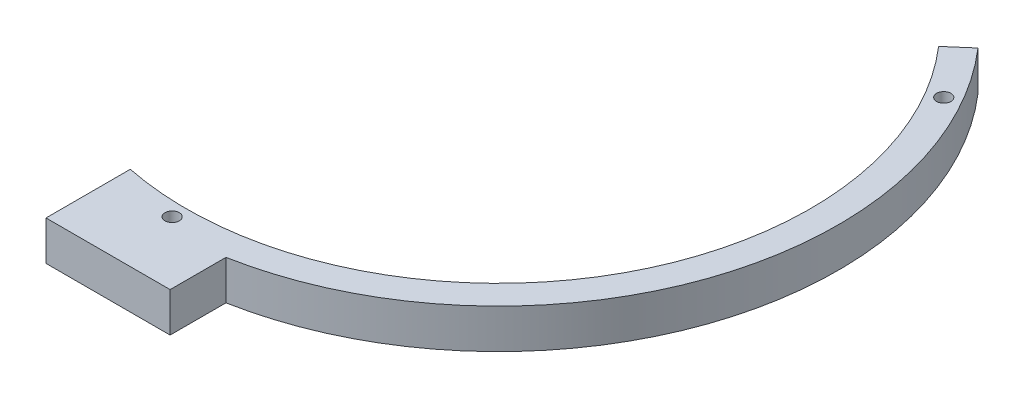
ISO-10303-21;
HEADER;
FILE_DESCRIPTION(('STEP AP214'),'2;1');
FILE_NAME('part.step','',(''),(''),'','','');
FILE_SCHEMA(('AUTOMOTIVE_DESIGN { 1 0 10303 214 1 1 1 1 }'));
ENDSEC;
DATA;
#1=APPLICATION_CONTEXT('core data for automotive mechanical design processes');
#2=APPLICATION_PROTOCOL_DEFINITION('international standard','automotive_design',2000,#1);
#3=PRODUCT_CONTEXT('',#1,'mechanical');
#4=PRODUCT('Part','Part','',(#3));
#5=PRODUCT_RELATED_PRODUCT_CATEGORY('part','',(#4));
#6=PRODUCT_DEFINITION_FORMATION('','',#4);
#7=PRODUCT_DEFINITION_CONTEXT('part definition',#1,'design');
#8=PRODUCT_DEFINITION('design','',#6,#7);
#9=PRODUCT_DEFINITION_SHAPE('','',#8);
#10=(LENGTH_UNIT() NAMED_UNIT(*) SI_UNIT(.MILLI.,.METRE.));
#11=(NAMED_UNIT(*) PLANE_ANGLE_UNIT() SI_UNIT($,.RADIAN.));
#12=(NAMED_UNIT(*) SI_UNIT($,.STERADIAN.) SOLID_ANGLE_UNIT());
#13=UNCERTAINTY_MEASURE_WITH_UNIT(LENGTH_MEASURE(1.E-05),#10,'distance_accuracy_value','');
#14=(GEOMETRIC_REPRESENTATION_CONTEXT(3) GLOBAL_UNCERTAINTY_ASSIGNED_CONTEXT((#13)) GLOBAL_UNIT_ASSIGNED_CONTEXT((#10,
#11,#12)) REPRESENTATION_CONTEXT('',''));
#15=CARTESIAN_POINT('',(0.,0.,0.));
#16=DIRECTION('',(0.,0.,1.));
#17=DIRECTION('',(1.,0.,0.));
#18=AXIS2_PLACEMENT_3D('',#15,#16,#17);
#19=CARTESIAN_POINT('',(0.,6.35,0.));
#20=DIRECTION('',(0.,1.,0.));
#21=DIRECTION('',(0.,0.,1.));
#22=AXIS2_PLACEMENT_3D('',#19,#20,#21);
#23=PLANE('',#22);
#24=CARTESIAN_POINT('',(0.,6.35,52.55));
#25=DIRECTION('',(0.,1.,0.));
#26=DIRECTION('',(0.,0.,1.));
#27=AXIS2_PLACEMENT_3D('',#24,#25,#26);
#28=CIRCLE('',#27,1.15);
#29=CARTESIAN_POINT('',(0.,6.35,53.7));
#30=VERTEX_POINT('',#29);
#31=EDGE_CURVE('E153',#30,#30,#28,.T.);
#32=ORIENTED_EDGE('',*,*,#31,.F.);
#33=EDGE_LOOP('',(#32));
#34=FACE_BOUND('',#33,.T.);
#35=CARTESIAN_POINT('',(45.5096349688721,6.35,-26.2750000000002));
#36=DIRECTION('',(0.,1.,0.));
#37=DIRECTION('',(0.866025403784436,0.,-0.500000000000004));
#38=AXIS2_PLACEMENT_3D('',#35,#36,#37);
#39=CIRCLE('',#38,1.15);
#40=CARTESIAN_POINT('',(46.5055641832242,6.35,-26.8500000000002));
#41=VERTEX_POINT('',#40);
#42=EDGE_CURVE('E160',#41,#41,#39,.T.);
#43=ORIENTED_EDGE('',*,*,#42,.F.);
#44=EDGE_LOOP('',(#43));
#45=FACE_BOUND('',#44,.T.);
#46=CARTESIAN_POINT('',(0.,6.35,0.));
#47=DIRECTION('',(0.,1.,0.));
#48=DIRECTION('',(0.,0.,1.));
#49=AXIS2_PLACEMENT_3D('',#46,#47,#48);
#50=CIRCLE('',#49,54.8);
#51=CARTESIAN_POINT('',(10.,6.35,53.8798663695448));
#52=VERTEX_POINT('',#51);
#53=CARTESIAN_POINT('',(41.376904985097,6.35,-35.9303734165714));
#54=VERTEX_POINT('',#53);
#55=EDGE_CURVE('E133',#52,#54,#50,.T.);
#56=ORIENTED_EDGE('',*,*,#55,.T.);
#57=DIRECTION('',(-0.755053010676952,0.,0.65566374847758));
#58=VECTOR('',#57,1.);
#59=CARTESIAN_POINT('',(0.,6.35,0.));
#60=LINE('',#59,#58);
#61=CARTESIAN_POINT('',(37.9791664370507,6.35,-32.9798865484223));
#62=VERTEX_POINT('',#61);
#63=EDGE_CURVE('E100',#54,#62,#60,.T.);
#64=ORIENTED_EDGE('',*,*,#63,.T.);
#65=CARTESIAN_POINT('',(0.,6.35,0.));
#66=DIRECTION('',(0.,1.,0.));
#67=DIRECTION('',(0.,0.,1.));
#68=AXIS2_PLACEMENT_3D('',#65,#66,#67);
#69=CIRCLE('',#68,50.3);
#70=CARTESIAN_POINT('',(-10.,6.35,49.2959430379418));
#71=VERTEX_POINT('',#70);
#72=EDGE_CURVE('E120',#71,#62,#69,.T.);
#73=ORIENTED_EDGE('',*,*,#72,.F.);
#74=DIRECTION('',(0.,0.,1.));
#75=VECTOR('',#74,1.);
#76=CARTESIAN_POINT('',(-10.,6.35,53.8798663695448));
#77=LINE('',#76,#75);
#78=CARTESIAN_POINT('',(-10.,6.35,62.8798663695448));
#79=VERTEX_POINT('',#78);
#80=EDGE_CURVE('E68',#71,#79,#77,.T.);
#81=ORIENTED_EDGE('',*,*,#80,.T.);
#82=DIRECTION('',(1.,0.,0.));
#83=VECTOR('',#82,1.);
#84=CARTESIAN_POINT('',(-10.,6.35,62.8798663695448));
#85=LINE('',#84,#83);
#86=CARTESIAN_POINT('',(10.,6.35,62.8798663695448));
#87=VERTEX_POINT('',#86);
#88=EDGE_CURVE('E143',#79,#87,#85,.T.);
#89=ORIENTED_EDGE('',*,*,#88,.T.);
#90=DIRECTION('',(0.,0.,-1.));
#91=VECTOR('',#90,1.);
#92=CARTESIAN_POINT('',(10.,6.35,62.8798663695448));
#93=LINE('',#92,#91);
#94=EDGE_CURVE('E127',#87,#52,#93,.T.);
#95=ORIENTED_EDGE('',*,*,#94,.T.);
#96=EDGE_LOOP('',(#56,#64,#73,#81,#89,#95));
#97=FACE_BOUND('',#96,.T.);
#98=ADVANCED_FACE('F45',(#34,#45,#97),#23,.T.);
#99=CARTESIAN_POINT('',(0.,0.,0.));
#100=DIRECTION('',(0.,1.,0.));
#101=DIRECTION('',(0.,0.,1.));
#102=AXIS2_PLACEMENT_3D('',#99,#100,#101);
#103=PLANE('',#102);
#104=CARTESIAN_POINT('',(0.,0.,52.55));
#105=DIRECTION('',(0.,1.,0.));
#106=DIRECTION('',(0.,0.,1.));
#107=AXIS2_PLACEMENT_3D('',#104,#105,#106);
#108=CIRCLE('',#107,1.15);
#109=CARTESIAN_POINT('',(0.,0.,53.7));
#110=VERTEX_POINT('',#109);
#111=EDGE_CURVE('E150',#110,#110,#108,.F.);
#112=ORIENTED_EDGE('',*,*,#111,.F.);
#113=EDGE_LOOP('',(#112));
#114=FACE_BOUND('',#113,.T.);
#115=CARTESIAN_POINT('',(45.5096349688721,0.,-26.2750000000002));
#116=DIRECTION('',(0.,1.,0.));
#117=DIRECTION('',(0.,0.,1.));
#118=AXIS2_PLACEMENT_3D('',#115,#116,#117);
#119=CIRCLE('',#118,1.15);
#120=CARTESIAN_POINT('',(45.5096349688721,0.,-25.1250000000002));
#121=VERTEX_POINT('',#120);
#122=EDGE_CURVE('E164',#121,#121,#119,.F.);
#123=ORIENTED_EDGE('',*,*,#122,.F.);
#124=EDGE_LOOP('',(#123));
#125=FACE_BOUND('',#124,.T.);
#126=DIRECTION('',(0.755053010676952,0.,-0.65566374847758));
#127=VECTOR('',#126,1.);
#128=CARTESIAN_POINT('',(0.,0.,0.));
#129=LINE('',#128,#127);
#130=CARTESIAN_POINT('',(37.9791664370507,0.,-32.9798865484223));
#131=VERTEX_POINT('',#130);
#132=CARTESIAN_POINT('',(41.3769049850969,0.,-35.9303734165714));
#133=VERTEX_POINT('',#132);
#134=EDGE_CURVE('E60',#131,#133,#129,.T.);
#135=ORIENTED_EDGE('',*,*,#134,.T.);
#136=CARTESIAN_POINT('',(0.,0.,0.));
#137=DIRECTION('',(0.,1.,0.));
#138=DIRECTION('',(0.,0.,1.));
#139=AXIS2_PLACEMENT_3D('',#136,#137,#138);
#140=CIRCLE('',#139,54.8);
#141=CARTESIAN_POINT('',(10.,0.,53.8798663695448));
#142=VERTEX_POINT('',#141);
#143=EDGE_CURVE('E112',#142,#133,#140,.T.);
#144=ORIENTED_EDGE('',*,*,#143,.F.);
#145=DIRECTION('',(0.,0.,-1.));
#146=VECTOR('',#145,1.);
#147=CARTESIAN_POINT('',(10.,0.,62.8798663695448));
#148=LINE('',#147,#146);
#149=CARTESIAN_POINT('',(10.,0.,62.8798663695448));
#150=VERTEX_POINT('',#149);
#151=EDGE_CURVE('E131',#150,#142,#148,.T.);
#152=ORIENTED_EDGE('',*,*,#151,.F.);
#153=DIRECTION('',(1.,0.,0.));
#154=VECTOR('',#153,1.);
#155=CARTESIAN_POINT('',(-10.,0.,62.8798663695448));
#156=LINE('',#155,#154);
#157=CARTESIAN_POINT('',(-10.,0.,62.8798663695448));
#158=VERTEX_POINT('',#157);
#159=EDGE_CURVE('E122',#158,#150,#156,.T.);
#160=ORIENTED_EDGE('',*,*,#159,.F.);
#161=DIRECTION('',(0.,0.,1.));
#162=VECTOR('',#161,1.);
#163=CARTESIAN_POINT('',(-10.,0.,53.8798663695448));
#164=LINE('',#163,#162);
#165=CARTESIAN_POINT('',(-10.,0.,49.2959430379418));
#166=VERTEX_POINT('',#165);
#167=EDGE_CURVE('E119',#166,#158,#164,.T.);
#168=ORIENTED_EDGE('',*,*,#167,.F.);
#169=CARTESIAN_POINT('',(0.,0.,0.));
#170=DIRECTION('',(0.,1.,0.));
#171=DIRECTION('',(0.,0.,1.));
#172=AXIS2_PLACEMENT_3D('',#169,#170,#171);
#173=CIRCLE('',#172,50.3);
#174=EDGE_CURVE('E114',#166,#131,#173,.T.);
#175=ORIENTED_EDGE('',*,*,#174,.T.);
#176=EDGE_LOOP('',(#135,#144,#152,#160,#168,#175));
#177=FACE_BOUND('',#176,.T.);
#178=ADVANCED_FACE('F110',(#114,#125,#177),#103,.F.);
#179=CARTESIAN_POINT('',(0.,6.35,0.));
#180=DIRECTION('',(0.,-1.,0.));
#181=DIRECTION('',(0.,0.,-1.));
#182=AXIS2_PLACEMENT_3D('',#179,#180,#181);
#183=CYLINDRICAL_SURFACE('',#182,54.8);
#184=DIRECTION('',(0.,1.,0.));
#185=VECTOR('',#184,1.);
#186=CARTESIAN_POINT('',(41.376904985097,-0.00100000000000013,-35.9303734165714));
#187=LINE('',#186,#185);
#188=EDGE_CURVE('E97',#133,#54,#187,.T.);
#189=ORIENTED_EDGE('',*,*,#188,.T.);
#190=ORIENTED_EDGE('',*,*,#55,.F.);
#191=DIRECTION('',(0.,-1.,0.));
#192=VECTOR('',#191,1.);
#193=CARTESIAN_POINT('',(10.,6.35,53.8798663695448));
#194=LINE('',#193,#192);
#195=EDGE_CURVE('E118',#52,#142,#194,.T.);
#196=ORIENTED_EDGE('',*,*,#195,.T.);
#197=ORIENTED_EDGE('',*,*,#143,.T.);
#198=EDGE_LOOP('',(#189,#190,#196,#197));
#199=FACE_BOUND('',#198,.T.);
#200=ADVANCED_FACE('F47',(#199),#183,.T.);
#201=CARTESIAN_POINT('',(0.,6.35,0.));
#202=DIRECTION('',(0.,-1.,0.));
#203=DIRECTION('',(0.,0.,-1.));
#204=AXIS2_PLACEMENT_3D('',#201,#202,#203);
#205=CYLINDRICAL_SURFACE('',#204,50.3);
#206=ORIENTED_EDGE('',*,*,#72,.T.);
#207=DIRECTION('',(0.,1.,0.));
#208=VECTOR('',#207,1.);
#209=CARTESIAN_POINT('',(37.9791664370507,-0.00100000000000013,-32.9798865484223));
#210=LINE('',#209,#208);
#211=EDGE_CURVE('E147',#131,#62,#210,.T.);
#212=ORIENTED_EDGE('',*,*,#211,.F.);
#213=ORIENTED_EDGE('',*,*,#174,.F.);
#214=DIRECTION('',(0.,1.,0.));
#215=VECTOR('',#214,1.);
#216=CARTESIAN_POINT('',(-10.,-0.00100000000000013,49.2959430379418));
#217=LINE('',#216,#215);
#218=EDGE_CURVE('E105',#166,#71,#217,.T.);
#219=ORIENTED_EDGE('',*,*,#218,.T.);
#220=EDGE_LOOP('',(#206,#212,#213,#219));
#221=FACE_BOUND('',#220,.T.);
#222=ADVANCED_FACE('F149',(#221),#205,.F.);
#223=CARTESIAN_POINT('',(-10.,6.35,53.8798663695448));
#224=DIRECTION('',(1.,0.,0.));
#225=DIRECTION('',(0.,0.,-1.));
#226=AXIS2_PLACEMENT_3D('',#223,#224,#225);
#227=PLANE('',#226);
#228=ORIENTED_EDGE('',*,*,#167,.T.);
#229=DIRECTION('',(0.,-1.,0.));
#230=VECTOR('',#229,1.);
#231=CARTESIAN_POINT('',(-10.,6.35,62.8798663695448));
#232=LINE('',#231,#230);
#233=EDGE_CURVE('E11',#79,#158,#232,.T.);
#234=ORIENTED_EDGE('',*,*,#233,.F.);
#235=ORIENTED_EDGE('',*,*,#80,.F.);
#236=ORIENTED_EDGE('',*,*,#218,.F.);
#237=EDGE_LOOP('',(#228,#234,#235,#236));
#238=FACE_BOUND('',#237,.T.);
#239=ADVANCED_FACE('F144',(#238),#227,.F.);
#240=CARTESIAN_POINT('',(-10.,6.35,62.8798663695448));
#241=DIRECTION('',(0.,0.,-1.));
#242=DIRECTION('',(-1.,0.,0.));
#243=AXIS2_PLACEMENT_3D('',#240,#241,#242);
#244=PLANE('',#243);
#245=ORIENTED_EDGE('',*,*,#159,.T.);
#246=DIRECTION('',(0.,-1.,0.));
#247=VECTOR('',#246,1.);
#248=CARTESIAN_POINT('',(10.,6.35,62.8798663695448));
#249=LINE('',#248,#247);
#250=EDGE_CURVE('E53',#87,#150,#249,.T.);
#251=ORIENTED_EDGE('',*,*,#250,.F.);
#252=ORIENTED_EDGE('',*,*,#88,.F.);
#253=ORIENTED_EDGE('',*,*,#233,.T.);
#254=EDGE_LOOP('',(#245,#251,#252,#253));
#255=FACE_BOUND('',#254,.T.);
#256=ADVANCED_FACE('F142',(#255),#244,.F.);
#257=CARTESIAN_POINT('',(10.,6.35,62.8798663695448));
#258=DIRECTION('',(-1.,0.,0.));
#259=DIRECTION('',(0.,0.,1.));
#260=AXIS2_PLACEMENT_3D('',#257,#258,#259);
#261=PLANE('',#260);
#262=ORIENTED_EDGE('',*,*,#151,.T.);
#263=ORIENTED_EDGE('',*,*,#195,.F.);
#264=ORIENTED_EDGE('',*,*,#94,.F.);
#265=ORIENTED_EDGE('',*,*,#250,.T.);
#266=EDGE_LOOP('',(#262,#263,#264,#265));
#267=FACE_BOUND('',#266,.T.);
#268=ADVANCED_FACE('F138',(#267),#261,.F.);
#269=CARTESIAN_POINT('',(0.,-0.00100000000000013,52.55));
#270=DIRECTION('',(0.,1.,0.));
#271=DIRECTION('',(0.,0.,1.));
#272=AXIS2_PLACEMENT_3D('',#269,#270,#271);
#273=CYLINDRICAL_SURFACE('',#272,1.15);
#274=ORIENTED_EDGE('',*,*,#31,.T.);
#275=EDGE_LOOP('',(#274));
#276=FACE_BOUND('',#275,.T.);
#277=ORIENTED_EDGE('',*,*,#111,.T.);
#278=EDGE_LOOP('',(#277));
#279=FACE_BOUND('',#278,.T.);
#280=ADVANCED_FACE('F170',(#276,#279),#273,.F.);
#281=CARTESIAN_POINT('',(45.5096349688721,-0.00100000000000013,-26.2750000000002));
#282=DIRECTION('',(0.,1.,0.));
#283=DIRECTION('',(0.,0.,1.));
#284=AXIS2_PLACEMENT_3D('',#281,#282,#283);
#285=CYLINDRICAL_SURFACE('',#284,1.15);
#286=ORIENTED_EDGE('',*,*,#42,.T.);
#287=EDGE_LOOP('',(#286));
#288=FACE_BOUND('',#287,.T.);
#289=ORIENTED_EDGE('',*,*,#122,.T.);
#290=EDGE_LOOP('',(#289));
#291=FACE_BOUND('',#290,.T.);
#292=ADVANCED_FACE('F178',(#288,#291),#285,.F.);
#293=CARTESIAN_POINT('',(0.,-0.00100000000000013,0.));
#294=DIRECTION('',(-0.65566374847758,0.,-0.755053010676952));
#295=DIRECTION('',(-0.755053010676952,0.,0.65566374847758));
#296=AXIS2_PLACEMENT_3D('',#293,#294,#295);
#297=PLANE('',#296);
#298=ORIENTED_EDGE('',*,*,#211,.T.);
#299=ORIENTED_EDGE('',*,*,#63,.F.);
#300=ORIENTED_EDGE('',*,*,#188,.F.);
#301=ORIENTED_EDGE('',*,*,#134,.F.);
#302=EDGE_LOOP('',(#298,#299,#300,#301));
#303=FACE_BOUND('',#302,.T.);
#304=ADVANCED_FACE('F98',(#303),#297,.T.);
#305=CLOSED_SHELL('',(#98,#178,#200,#222,#239,#256,#268,#280,#292,#304));
#306=MANIFOLD_SOLID_BREP('B2',#305);
#307=ADVANCED_BREP_SHAPE_REPRESENTATION('',(#18,#306),#14);
#308=SHAPE_DEFINITION_REPRESENTATION(#9,#307);
ENDSEC;
END-ISO-10303-21;
